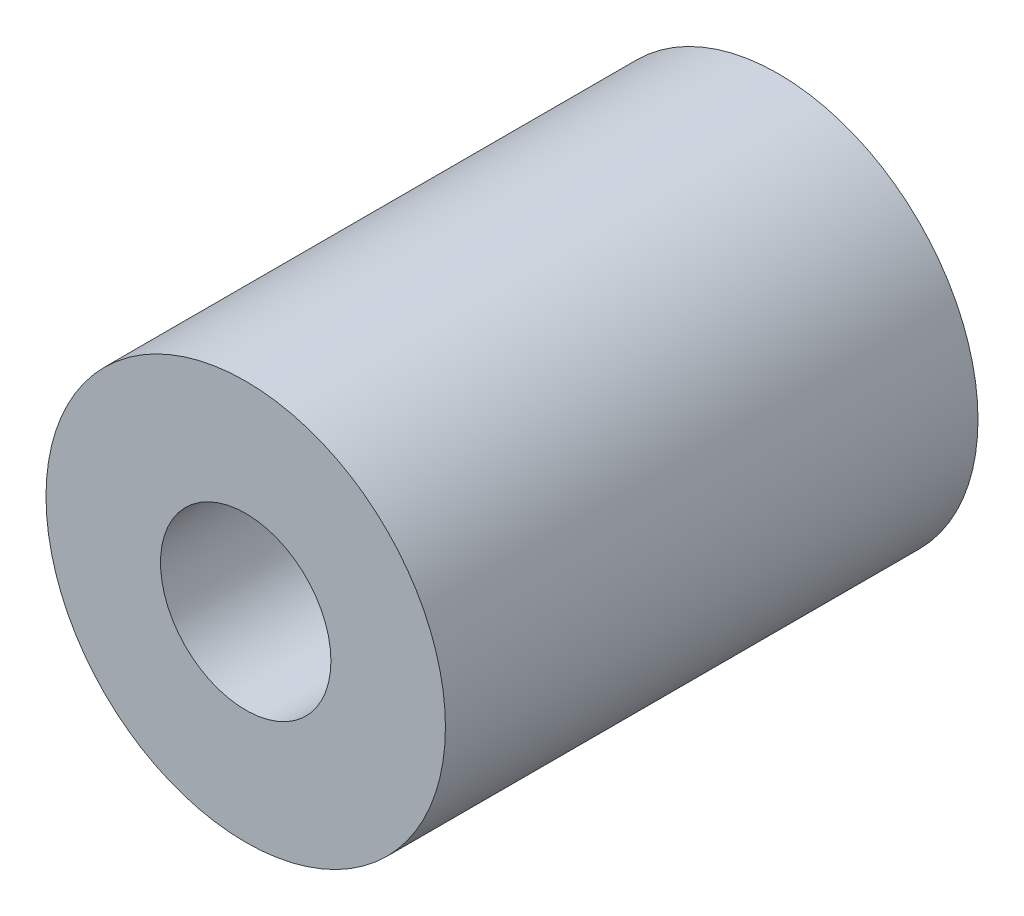
ISO-10303-21;
HEADER;
FILE_DESCRIPTION(('STEP AP214'),'2;1');
FILE_NAME('part.step','',(''),(''),'','','');
FILE_SCHEMA(('AUTOMOTIVE_DESIGN { 1 0 10303 214 1 1 1 1 }'));
ENDSEC;
DATA;
#1=APPLICATION_CONTEXT('core data for automotive mechanical design processes');
#2=APPLICATION_PROTOCOL_DEFINITION('international standard','automotive_design',2000,#1);
#3=PRODUCT_CONTEXT('',#1,'mechanical');
#4=PRODUCT('Part','Part','',(#3));
#5=PRODUCT_RELATED_PRODUCT_CATEGORY('part','',(#4));
#6=PRODUCT_DEFINITION_FORMATION('','',#4);
#7=PRODUCT_DEFINITION_CONTEXT('part definition',#1,'design');
#8=PRODUCT_DEFINITION('design','',#6,#7);
#9=PRODUCT_DEFINITION_SHAPE('','',#8);
#10=(LENGTH_UNIT() NAMED_UNIT(*) SI_UNIT(.MILLI.,.METRE.));
#11=(NAMED_UNIT(*) PLANE_ANGLE_UNIT() SI_UNIT($,.RADIAN.));
#12=(NAMED_UNIT(*) SI_UNIT($,.STERADIAN.) SOLID_ANGLE_UNIT());
#13=UNCERTAINTY_MEASURE_WITH_UNIT(LENGTH_MEASURE(1.E-05),#10,'distance_accuracy_value','');
#14=(GEOMETRIC_REPRESENTATION_CONTEXT(3) GLOBAL_UNCERTAINTY_ASSIGNED_CONTEXT((#13)) GLOBAL_UNIT_ASSIGNED_CONTEXT((#10,
#11,#12)) REPRESENTATION_CONTEXT('',''));
#15=CARTESIAN_POINT('',(0.,0.,0.));
#16=DIRECTION('',(0.,0.,1.));
#17=DIRECTION('',(1.,0.,0.));
#18=AXIS2_PLACEMENT_3D('',#15,#16,#17);
#19=CARTESIAN_POINT('',(0.,0.,20.));
#20=DIRECTION('',(0.,0.,1.));
#21=DIRECTION('',(1.,0.,0.));
#22=AXIS2_PLACEMENT_3D('',#19,#20,#21);
#23=PLANE('',#22);
#24=CARTESIAN_POINT('',(0.,0.,20.));
#25=DIRECTION('',(0.,0.,1.));
#26=DIRECTION('',(1.,0.,0.));
#27=AXIS2_PLACEMENT_3D('',#24,#25,#26);
#28=CIRCLE('',#27,7.5);
#29=CARTESIAN_POINT('',(7.5,0.,20.));
#30=VERTEX_POINT('',#29);
#31=EDGE_CURVE('E10',#30,#30,#28,.T.);
#32=ORIENTED_EDGE('',*,*,#31,.T.);
#33=EDGE_LOOP('',(#32));
#34=FACE_BOUND('',#33,.T.);
#35=CARTESIAN_POINT('',(0.,0.,20.));
#36=DIRECTION('',(0.,0.,1.));
#37=DIRECTION('',(1.,0.,0.));
#38=AXIS2_PLACEMENT_3D('',#35,#36,#37);
#39=CIRCLE('',#38,3.2);
#40=CARTESIAN_POINT('',(3.2,0.,20.));
#41=VERTEX_POINT('',#40);
#42=EDGE_CURVE('E44',#41,#41,#39,.T.);
#43=ORIENTED_EDGE('',*,*,#42,.F.);
#44=EDGE_LOOP('',(#43));
#45=FACE_BOUND('',#44,.T.);
#46=ADVANCED_FACE('F33',(#34,#45),#23,.T.);
#47=CARTESIAN_POINT('',(0.,0.,0.));
#48=DIRECTION('',(0.,0.,1.));
#49=DIRECTION('',(1.,0.,0.));
#50=AXIS2_PLACEMENT_3D('',#47,#48,#49);
#51=PLANE('',#50);
#52=CARTESIAN_POINT('',(0.,0.,0.));
#53=DIRECTION('',(0.,0.,1.));
#54=DIRECTION('',(1.,0.,0.));
#55=AXIS2_PLACEMENT_3D('',#52,#53,#54);
#56=CIRCLE('',#55,7.5);
#57=CARTESIAN_POINT('',(7.5,0.,0.));
#58=VERTEX_POINT('',#57);
#59=EDGE_CURVE('E37',#58,#58,#56,.T.);
#60=ORIENTED_EDGE('',*,*,#59,.F.);
#61=EDGE_LOOP('',(#60));
#62=FACE_BOUND('',#61,.T.);
#63=CARTESIAN_POINT('',(0.,0.,0.));
#64=DIRECTION('',(0.,0.,1.));
#65=DIRECTION('',(1.,0.,0.));
#66=AXIS2_PLACEMENT_3D('',#63,#64,#65);
#67=CIRCLE('',#66,3.2);
#68=CARTESIAN_POINT('',(3.2,0.,0.));
#69=VERTEX_POINT('',#68);
#70=EDGE_CURVE('E46',#69,#69,#67,.T.);
#71=ORIENTED_EDGE('',*,*,#70,.T.);
#72=EDGE_LOOP('',(#71));
#73=FACE_BOUND('',#72,.T.);
#74=ADVANCED_FACE('F56',(#62,#73),#51,.F.);
#75=CARTESIAN_POINT('',(0.,0.,20.));
#76=DIRECTION('',(0.,0.,-1.));
#77=DIRECTION('',(-1.,0.,0.));
#78=AXIS2_PLACEMENT_3D('',#75,#76,#77);
#79=CYLINDRICAL_SURFACE('',#78,7.5);
#80=ORIENTED_EDGE('',*,*,#31,.F.);
#81=EDGE_LOOP('',(#80));
#82=FACE_BOUND('',#81,.T.);
#83=ORIENTED_EDGE('',*,*,#59,.T.);
#84=EDGE_LOOP('',(#83));
#85=FACE_BOUND('',#84,.T.);
#86=ADVANCED_FACE('F35',(#82,#85),#79,.T.);
#87=CARTESIAN_POINT('',(0.,0.,20.));
#88=DIRECTION('',(0.,0.,-1.));
#89=DIRECTION('',(-1.,0.,0.));
#90=AXIS2_PLACEMENT_3D('',#87,#88,#89);
#91=CYLINDRICAL_SURFACE('',#90,3.2);
#92=ORIENTED_EDGE('',*,*,#42,.T.);
#93=EDGE_LOOP('',(#92));
#94=FACE_BOUND('',#93,.T.);
#95=ORIENTED_EDGE('',*,*,#70,.F.);
#96=EDGE_LOOP('',(#95));
#97=FACE_BOUND('',#96,.T.);
#98=ADVANCED_FACE('F52',(#94,#97),#91,.F.);
#99=CLOSED_SHELL('',(#46,#74,#86,#98));
#100=MANIFOLD_SOLID_BREP('B2',#99);
#101=ADVANCED_BREP_SHAPE_REPRESENTATION('',(#18,#100),#14);
#102=SHAPE_DEFINITION_REPRESENTATION(#9,#101);
ENDSEC;
END-ISO-10303-21;
